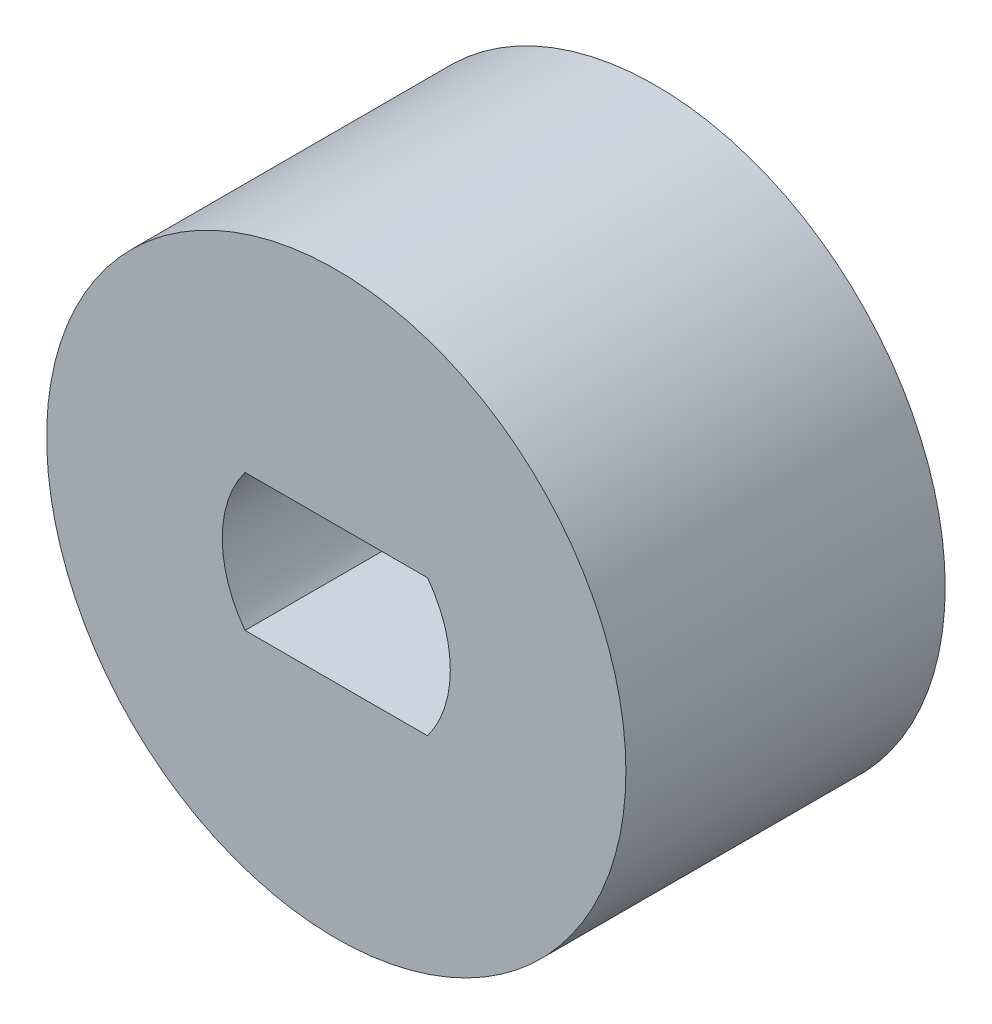
ISO-10303-21;
HEADER;
FILE_DESCRIPTION(('STEP AP214'),'2;1');
FILE_NAME('part.step','',(''),(''),'','','');
FILE_SCHEMA(('AUTOMOTIVE_DESIGN { 1 0 10303 214 1 1 1 1 }'));
ENDSEC;
DATA;
#1=APPLICATION_CONTEXT('core data for automotive mechanical design processes');
#2=APPLICATION_PROTOCOL_DEFINITION('international standard','automotive_design',2000,#1);
#3=PRODUCT_CONTEXT('',#1,'mechanical');
#4=PRODUCT('Part','Part','',(#3));
#5=PRODUCT_RELATED_PRODUCT_CATEGORY('part','',(#4));
#6=PRODUCT_DEFINITION_FORMATION('','',#4);
#7=PRODUCT_DEFINITION_CONTEXT('part definition',#1,'design');
#8=PRODUCT_DEFINITION('design','',#6,#7);
#9=PRODUCT_DEFINITION_SHAPE('','',#8);
#10=(LENGTH_UNIT() NAMED_UNIT(*) SI_UNIT(.MILLI.,.METRE.));
#11=(NAMED_UNIT(*) PLANE_ANGLE_UNIT() SI_UNIT($,.RADIAN.));
#12=(NAMED_UNIT(*) SI_UNIT($,.STERADIAN.) SOLID_ANGLE_UNIT());
#13=UNCERTAINTY_MEASURE_WITH_UNIT(LENGTH_MEASURE(1.E-05),#10,'distance_accuracy_value','');
#14=(GEOMETRIC_REPRESENTATION_CONTEXT(3) GLOBAL_UNCERTAINTY_ASSIGNED_CONTEXT((#13)) GLOBAL_UNIT_ASSIGNED_CONTEXT((#10,
#11,#12)) REPRESENTATION_CONTEXT('',''));
#15=CARTESIAN_POINT('',(0.,0.,0.));
#16=DIRECTION('',(0.,0.,1.));
#17=DIRECTION('',(1.,0.,0.));
#18=AXIS2_PLACEMENT_3D('',#15,#16,#17);
#19=CARTESIAN_POINT('',(0.,0.,7.));
#20=DIRECTION('',(0.,0.,1.));
#21=DIRECTION('',(1.,0.,0.));
#22=AXIS2_PLACEMENT_3D('',#19,#20,#21);
#23=PLANE('',#22);
#24=CARTESIAN_POINT('',(0.,0.,7.));
#25=DIRECTION('',(0.,0.,1.));
#26=DIRECTION('',(1.,0.,0.));
#27=AXIS2_PLACEMENT_3D('',#24,#25,#26);
#28=CIRCLE('',#27,6.35);
#29=CARTESIAN_POINT('',(6.35,0.,7.));
#30=VERTEX_POINT('',#29);
#31=EDGE_CURVE('E11',#30,#30,#28,.T.);
#32=ORIENTED_EDGE('',*,*,#31,.T.);
#33=EDGE_LOOP('',(#32));
#34=FACE_BOUND('',#33,.T.);
#35=DIRECTION('',(1.,0.,0.));
#36=VECTOR('',#35,1.);
#37=CARTESIAN_POINT('',(-2.,-1.5,7.));
#38=LINE('',#37,#36);
#39=CARTESIAN_POINT('',(-2.,-1.5,7.));
#40=VERTEX_POINT('',#39);
#41=CARTESIAN_POINT('',(2.,-1.5,7.));
#42=VERTEX_POINT('',#41);
#43=EDGE_CURVE('E98',#40,#42,#38,.T.);
#44=ORIENTED_EDGE('',*,*,#43,.F.);
#45=CARTESIAN_POINT('',(0.,0.,7.));
#46=DIRECTION('',(0.,0.,1.));
#47=DIRECTION('',(1.,0.,0.));
#48=AXIS2_PLACEMENT_3D('',#45,#46,#47);
#49=CIRCLE('',#48,2.5);
#50=CARTESIAN_POINT('',(-2.,1.5,7.));
#51=VERTEX_POINT('',#50);
#52=EDGE_CURVE('E89',#51,#40,#49,.T.);
#53=ORIENTED_EDGE('',*,*,#52,.F.);
#54=DIRECTION('',(-1.,0.,0.));
#55=VECTOR('',#54,1.);
#56=CARTESIAN_POINT('',(2.,1.5,7.));
#57=LINE('',#56,#55);
#58=CARTESIAN_POINT('',(2.,1.5,7.));
#59=VERTEX_POINT('',#58);
#60=EDGE_CURVE('E115',#59,#51,#57,.T.);
#61=ORIENTED_EDGE('',*,*,#60,.F.);
#62=CARTESIAN_POINT('',(0.,0.,7.));
#63=DIRECTION('',(0.,0.,1.));
#64=DIRECTION('',(1.,0.,0.));
#65=AXIS2_PLACEMENT_3D('',#62,#63,#64);
#66=CIRCLE('',#65,2.5);
#67=EDGE_CURVE('E110',#42,#59,#66,.T.);
#68=ORIENTED_EDGE('',*,*,#67,.F.);
#69=EDGE_LOOP('',(#44,#53,#61,#68));
#70=FACE_BOUND('',#69,.T.);
#71=ADVANCED_FACE('F39',(#34,#70),#23,.T.);
#72=CARTESIAN_POINT('',(0.,0.,0.));
#73=DIRECTION('',(0.,0.,1.));
#74=DIRECTION('',(1.,0.,0.));
#75=AXIS2_PLACEMENT_3D('',#72,#73,#74);
#76=PLANE('',#75);
#77=CARTESIAN_POINT('',(0.,0.,0.));
#78=DIRECTION('',(0.,0.,1.));
#79=DIRECTION('',(1.,0.,0.));
#80=AXIS2_PLACEMENT_3D('',#77,#78,#79);
#81=CIRCLE('',#80,6.35);
#82=CARTESIAN_POINT('',(6.35,0.,0.));
#83=VERTEX_POINT('',#82);
#84=EDGE_CURVE('E43',#83,#83,#81,.T.);
#85=ORIENTED_EDGE('',*,*,#84,.F.);
#86=EDGE_LOOP('',(#85));
#87=FACE_BOUND('',#86,.T.);
#88=CARTESIAN_POINT('',(0.,0.,0.));
#89=DIRECTION('',(0.,0.,1.));
#90=DIRECTION('',(1.,0.,0.));
#91=AXIS2_PLACEMENT_3D('',#88,#89,#90);
#92=CIRCLE('',#91,2.5);
#93=CARTESIAN_POINT('',(-2.,1.5,0.));
#94=VERTEX_POINT('',#93);
#95=CARTESIAN_POINT('',(-2.,-1.5,0.));
#96=VERTEX_POINT('',#95);
#97=EDGE_CURVE('E68',#94,#96,#92,.T.);
#98=ORIENTED_EDGE('',*,*,#97,.T.);
#99=DIRECTION('',(1.,0.,0.));
#100=VECTOR('',#99,1.);
#101=CARTESIAN_POINT('',(-2.,-1.5,0.));
#102=LINE('',#101,#100);
#103=CARTESIAN_POINT('',(2.,-1.5,0.));
#104=VERTEX_POINT('',#103);
#105=EDGE_CURVE('E105',#96,#104,#102,.T.);
#106=ORIENTED_EDGE('',*,*,#105,.T.);
#107=CARTESIAN_POINT('',(0.,0.,0.));
#108=DIRECTION('',(0.,0.,1.));
#109=DIRECTION('',(1.,0.,0.));
#110=AXIS2_PLACEMENT_3D('',#107,#108,#109);
#111=CIRCLE('',#110,2.5);
#112=CARTESIAN_POINT('',(2.,1.5,0.));
#113=VERTEX_POINT('',#112);
#114=EDGE_CURVE('E124',#104,#113,#111,.T.);
#115=ORIENTED_EDGE('',*,*,#114,.T.);
#116=DIRECTION('',(-1.,0.,0.));
#117=VECTOR('',#116,1.);
#118=CARTESIAN_POINT('',(2.,1.5,0.));
#119=LINE('',#118,#117);
#120=EDGE_CURVE('E99',#113,#94,#119,.T.);
#121=ORIENTED_EDGE('',*,*,#120,.T.);
#122=EDGE_LOOP('',(#98,#106,#115,#121));
#123=FACE_BOUND('',#122,.T.);
#124=ADVANCED_FACE('F139',(#87,#123),#76,.F.);
#125=CARTESIAN_POINT('',(0.,0.,7.));
#126=DIRECTION('',(0.,0.,-1.));
#127=DIRECTION('',(-1.,0.,0.));
#128=AXIS2_PLACEMENT_3D('',#125,#126,#127);
#129=CYLINDRICAL_SURFACE('',#128,6.35);
#130=ORIENTED_EDGE('',*,*,#31,.F.);
#131=EDGE_LOOP('',(#130));
#132=FACE_BOUND('',#131,.T.);
#133=ORIENTED_EDGE('',*,*,#84,.T.);
#134=EDGE_LOOP('',(#133));
#135=FACE_BOUND('',#134,.T.);
#136=ADVANCED_FACE('F41',(#132,#135),#129,.T.);
#137=CARTESIAN_POINT('',(0.,0.,7.));
#138=DIRECTION('',(0.,0.,-1.));
#139=DIRECTION('',(-1.,0.,0.));
#140=AXIS2_PLACEMENT_3D('',#137,#138,#139);
#141=CYLINDRICAL_SURFACE('',#140,2.5);
#142=ORIENTED_EDGE('',*,*,#97,.F.);
#143=DIRECTION('',(0.,0.,-1.));
#144=VECTOR('',#143,1.);
#145=CARTESIAN_POINT('',(-2.,1.5,7.));
#146=LINE('',#145,#144);
#147=EDGE_CURVE('E93',#51,#94,#146,.T.);
#148=ORIENTED_EDGE('',*,*,#147,.F.);
#149=ORIENTED_EDGE('',*,*,#52,.T.);
#150=DIRECTION('',(0.,0.,-1.));
#151=VECTOR('',#150,1.);
#152=CARTESIAN_POINT('',(-2.,-1.5,7.));
#153=LINE('',#152,#151);
#154=EDGE_CURVE('E92',#40,#96,#153,.T.);
#155=ORIENTED_EDGE('',*,*,#154,.T.);
#156=EDGE_LOOP('',(#142,#148,#149,#155));
#157=FACE_BOUND('',#156,.T.);
#158=ADVANCED_FACE('F91',(#157),#141,.F.);
#159=CARTESIAN_POINT('',(-2.,-1.5,7.));
#160=DIRECTION('',(0.,1.,0.));
#161=DIRECTION('',(0.,0.,1.));
#162=AXIS2_PLACEMENT_3D('',#159,#160,#161);
#163=PLANE('',#162);
#164=ORIENTED_EDGE('',*,*,#105,.F.);
#165=ORIENTED_EDGE('',*,*,#154,.F.);
#166=ORIENTED_EDGE('',*,*,#43,.T.);
#167=DIRECTION('',(0.,0.,-1.));
#168=VECTOR('',#167,1.);
#169=CARTESIAN_POINT('',(2.,-1.5,7.));
#170=LINE('',#169,#168);
#171=EDGE_CURVE('E107',#42,#104,#170,.T.);
#172=ORIENTED_EDGE('',*,*,#171,.T.);
#173=EDGE_LOOP('',(#164,#165,#166,#172));
#174=FACE_BOUND('',#173,.T.);
#175=ADVANCED_FACE('F102',(#174),#163,.T.);
#176=CARTESIAN_POINT('',(0.,0.,7.));
#177=DIRECTION('',(0.,0.,-1.));
#178=DIRECTION('',(-1.,0.,0.));
#179=AXIS2_PLACEMENT_3D('',#176,#177,#178);
#180=CYLINDRICAL_SURFACE('',#179,2.5);
#181=ORIENTED_EDGE('',*,*,#114,.F.);
#182=ORIENTED_EDGE('',*,*,#171,.F.);
#183=ORIENTED_EDGE('',*,*,#67,.T.);
#184=DIRECTION('',(0.,0.,-1.));
#185=VECTOR('',#184,1.);
#186=CARTESIAN_POINT('',(2.,1.5,7.));
#187=LINE('',#186,#185);
#188=EDGE_CURVE('E57',#59,#113,#187,.T.);
#189=ORIENTED_EDGE('',*,*,#188,.T.);
#190=EDGE_LOOP('',(#181,#182,#183,#189));
#191=FACE_BOUND('',#190,.T.);
#192=ADVANCED_FACE('F137',(#191),#180,.F.);
#193=CARTESIAN_POINT('',(2.,1.5,7.));
#194=DIRECTION('',(0.,-1.,0.));
#195=DIRECTION('',(0.,0.,-1.));
#196=AXIS2_PLACEMENT_3D('',#193,#194,#195);
#197=PLANE('',#196);
#198=ORIENTED_EDGE('',*,*,#120,.F.);
#199=ORIENTED_EDGE('',*,*,#188,.F.);
#200=ORIENTED_EDGE('',*,*,#60,.T.);
#201=ORIENTED_EDGE('',*,*,#147,.T.);
#202=EDGE_LOOP('',(#198,#199,#200,#201));
#203=FACE_BOUND('',#202,.T.);
#204=ADVANCED_FACE('F140',(#203),#197,.T.);
#205=CLOSED_SHELL('',(#71,#124,#136,#158,#175,#192,#204));
#206=MANIFOLD_SOLID_BREP('B2',#205);
#207=ADVANCED_BREP_SHAPE_REPRESENTATION('',(#18,#206),#14);
#208=SHAPE_DEFINITION_REPRESENTATION(#9,#207);
ENDSEC;
END-ISO-10303-21;
